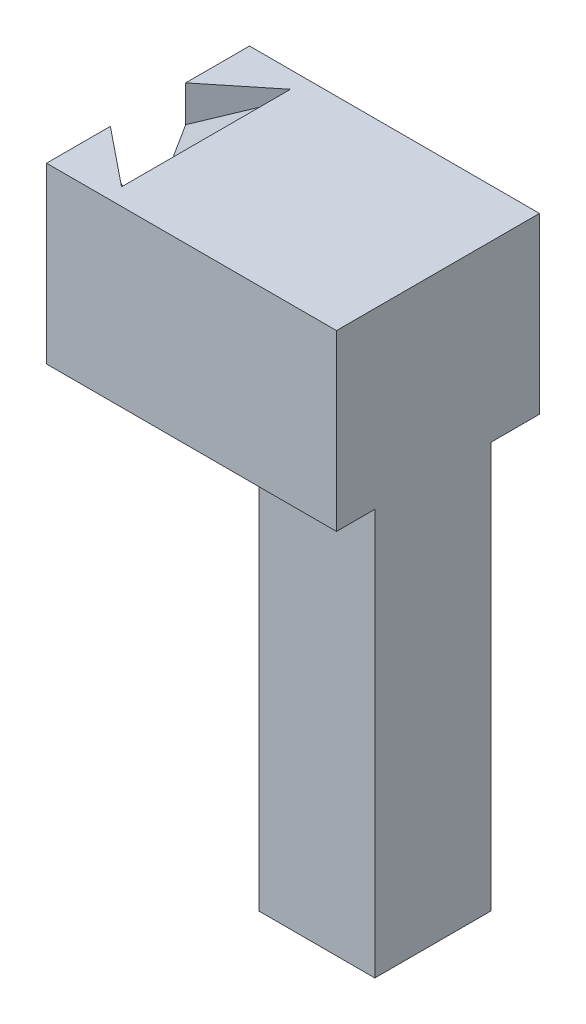
ISO-10303-21;
HEADER;
FILE_DESCRIPTION(('STEP AP214'),'2;1');
FILE_NAME('part.step','',(''),(''),'','','');
FILE_SCHEMA(('AUTOMOTIVE_DESIGN { 1 0 10303 214 1 1 1 1 }'));
ENDSEC;
DATA;
#1=APPLICATION_CONTEXT('core data for automotive mechanical design processes');
#2=APPLICATION_PROTOCOL_DEFINITION('international standard','automotive_design',2000,#1);
#3=PRODUCT_CONTEXT('',#1,'mechanical');
#4=PRODUCT('Part','Part','',(#3));
#5=PRODUCT_RELATED_PRODUCT_CATEGORY('part','',(#4));
#6=PRODUCT_DEFINITION_FORMATION('','',#4);
#7=PRODUCT_DEFINITION_CONTEXT('part definition',#1,'design');
#8=PRODUCT_DEFINITION('design','',#6,#7);
#9=PRODUCT_DEFINITION_SHAPE('','',#8);
#10=(LENGTH_UNIT() NAMED_UNIT(*) SI_UNIT(.MILLI.,.METRE.));
#11=(NAMED_UNIT(*) PLANE_ANGLE_UNIT() SI_UNIT($,.RADIAN.));
#12=(NAMED_UNIT(*) SI_UNIT($,.STERADIAN.) SOLID_ANGLE_UNIT());
#13=UNCERTAINTY_MEASURE_WITH_UNIT(LENGTH_MEASURE(1.E-05),#10,'distance_accuracy_value','');
#14=(GEOMETRIC_REPRESENTATION_CONTEXT(3) GLOBAL_UNCERTAINTY_ASSIGNED_CONTEXT((#13)) GLOBAL_UNIT_ASSIGNED_CONTEXT((#10,
#11,#12)) REPRESENTATION_CONTEXT('',''));
#15=CARTESIAN_POINT('',(0.,0.,0.));
#16=DIRECTION('',(0.,0.,1.));
#17=DIRECTION('',(1.,0.,0.));
#18=AXIS2_PLACEMENT_3D('',#15,#16,#17);
#19=CARTESIAN_POINT('',(0.,200.,0.));
#20=DIRECTION('',(0.,-1.,0.));
#21=DIRECTION('',(0.,0.,-1.));
#22=AXIS2_PLACEMENT_3D('',#19,#20,#21);
#23=PLANE('',#22);
#24=DIRECTION('',(0.,0.,-1.));
#25=VECTOR('',#24,1.);
#26=CARTESIAN_POINT('',(-80.,200.,-36.7720056850076));
#27=LINE('',#26,#25);
#28=CARTESIAN_POINT('',(-80.,200.,-14.7623867417742));
#29=VERTEX_POINT('',#28);
#30=CARTESIAN_POINT('',(-80.,200.,-36.7720056850076));
#31=VERTEX_POINT('',#30);
#32=EDGE_CURVE('E159',#29,#31,#27,.T.);
#33=ORIENTED_EDGE('',*,*,#32,.F.);
#34=DIRECTION('',(-0.777950212207444,0.,0.628325924442397));
#35=VECTOR('',#34,1.);
#36=CARTESIAN_POINT('',(-80.,200.,-14.7623867417742));
#37=LINE('',#36,#35);
#38=CARTESIAN_POINT('',(-60.,200.,-30.9157578594326));
#39=VERTEX_POINT('',#38);
#40=EDGE_CURVE('E142',#39,#29,#37,.T.);
#41=ORIENTED_EDGE('',*,*,#40,.F.);
#42=DIRECTION('',(0.,0.,-1.));
#43=VECTOR('',#42,1.);
#44=CARTESIAN_POINT('',(-60.,200.,-30.9157578594326));
#45=LINE('',#44,#43);
#46=CARTESIAN_POINT('',(-60.,200.,27.3717464894172));
#47=VERTEX_POINT('',#46);
#48=EDGE_CURVE('E152',#47,#39,#45,.T.);
#49=ORIENTED_EDGE('',*,*,#48,.F.);
#50=DIRECTION('',(0.777950212207444,0.,0.628325924442397));
#51=VECTOR('',#50,1.);
#52=CARTESIAN_POINT('',(-60.,200.,27.3717464894172));
#53=LINE('',#52,#51);
#54=CARTESIAN_POINT('',(-80.,200.,11.2183753717588));
#55=VERTEX_POINT('',#54);
#56=EDGE_CURVE('E133',#55,#47,#53,.T.);
#57=ORIENTED_EDGE('',*,*,#56,.F.);
#58=CARTESIAN_POINT('',(-80.,200.,33.2279943149924));
#59=VERTEX_POINT('',#58);
#60=EDGE_CURVE('E148',#59,#55,#27,.T.);
#61=ORIENTED_EDGE('',*,*,#60,.F.);
#62=DIRECTION('',(-1.,0.,0.));
#63=VECTOR('',#62,1.);
#64=CARTESIAN_POINT('',(112.195444572929,200.,33.2279943149924));
#65=LINE('',#64,#63);
#66=CARTESIAN_POINT('',(20.,200.,33.2279943149924));
#67=VERTEX_POINT('',#66);
#68=EDGE_CURVE('E168',#67,#59,#65,.T.);
#69=ORIENTED_EDGE('',*,*,#68,.F.);
#70=DIRECTION('',(0.,0.,-1.));
#71=VECTOR('',#70,1.);
#72=CARTESIAN_POINT('',(20.,200.,20.));
#73=LINE('',#72,#71);
#74=CARTESIAN_POINT('',(20.,200.,-36.7720056850076));
#75=VERTEX_POINT('',#74);
#76=EDGE_CURVE('E190',#67,#75,#73,.T.);
#77=ORIENTED_EDGE('',*,*,#76,.T.);
#78=DIRECTION('',(-1.,0.,0.));
#79=VECTOR('',#78,1.);
#80=CARTESIAN_POINT('',(112.195444572929,200.,-36.7720056850076));
#81=LINE('',#80,#79);
#82=EDGE_CURVE('E181',#75,#31,#81,.T.);
#83=ORIENTED_EDGE('',*,*,#82,.T.);
#84=EDGE_LOOP('',(#33,#41,#49,#57,#61,#69,#77,#83));
#85=FACE_BOUND('',#84,.T.);
#86=ADVANCED_FACE('F35',(#85),#23,.F.);
#87=CARTESIAN_POINT('',(0.,0.,0.));
#88=DIRECTION('',(0.,-1.,0.));
#89=DIRECTION('',(0.,0.,-1.));
#90=AXIS2_PLACEMENT_3D('',#87,#88,#89);
#91=PLANE('',#90);
#92=DIRECTION('',(0.,0.,-1.));
#93=VECTOR('',#92,1.);
#94=CARTESIAN_POINT('',(20.,0.,20.));
#95=LINE('',#94,#93);
#96=CARTESIAN_POINT('',(20.,0.,20.));
#97=VERTEX_POINT('',#96);
#98=CARTESIAN_POINT('',(20.,0.,-20.));
#99=VERTEX_POINT('',#98);
#100=EDGE_CURVE('E193',#97,#99,#95,.T.);
#101=ORIENTED_EDGE('',*,*,#100,.F.);
#102=DIRECTION('',(1.,0.,0.));
#103=VECTOR('',#102,1.);
#104=CARTESIAN_POINT('',(-20.,0.,20.));
#105=LINE('',#104,#103);
#106=CARTESIAN_POINT('',(-20.,0.,20.));
#107=VERTEX_POINT('',#106);
#108=EDGE_CURVE('E42',#107,#97,#105,.T.);
#109=ORIENTED_EDGE('',*,*,#108,.F.);
#110=DIRECTION('',(0.,0.,1.));
#111=VECTOR('',#110,1.);
#112=CARTESIAN_POINT('',(-20.,0.,20.));
#113=LINE('',#112,#111);
#114=CARTESIAN_POINT('',(-20.,0.,-20.));
#115=VERTEX_POINT('',#114);
#116=EDGE_CURVE('E204',#115,#107,#113,.T.);
#117=ORIENTED_EDGE('',*,*,#116,.F.);
#118=DIRECTION('',(-1.,0.,0.));
#119=VECTOR('',#118,1.);
#120=CARTESIAN_POINT('',(-20.,0.,-20.));
#121=LINE('',#120,#119);
#122=EDGE_CURVE('E198',#99,#115,#121,.T.);
#123=ORIENTED_EDGE('',*,*,#122,.F.);
#124=EDGE_LOOP('',(#101,#109,#117,#123));
#125=FACE_BOUND('',#124,.T.);
#126=ADVANCED_FACE('F218',(#125),#91,.T.);
#127=CARTESIAN_POINT('',(20.,200.,20.));
#128=DIRECTION('',(-1.,0.,0.));
#129=DIRECTION('',(0.,0.,1.));
#130=AXIS2_PLACEMENT_3D('',#127,#128,#129);
#131=PLANE('',#130);
#132=DIRECTION('',(0.,-1.,0.));
#133=VECTOR('',#132,1.);
#134=CARTESIAN_POINT('',(20.,200.,-20.));
#135=LINE('',#134,#133);
#136=CARTESIAN_POINT('',(20.,140.,-20.));
#137=VERTEX_POINT('',#136);
#138=EDGE_CURVE('E196',#137,#99,#135,.T.);
#139=ORIENTED_EDGE('',*,*,#138,.F.);
#140=DIRECTION('',(0.,0.,-1.));
#141=VECTOR('',#140,1.);
#142=CARTESIAN_POINT('',(20.,140.,-36.7720056850076));
#143=LINE('',#142,#141);
#144=CARTESIAN_POINT('',(20.,140.,-36.7720056850076));
#145=VERTEX_POINT('',#144);
#146=EDGE_CURVE('E172',#137,#145,#143,.T.);
#147=ORIENTED_EDGE('',*,*,#146,.T.);
#148=DIRECTION('',(0.,1.,0.));
#149=VECTOR('',#148,1.);
#150=CARTESIAN_POINT('',(20.,140.,-36.7720056850076));
#151=LINE('',#150,#149);
#152=EDGE_CURVE('E169',#145,#75,#151,.T.);
#153=ORIENTED_EDGE('',*,*,#152,.T.);
#154=ORIENTED_EDGE('',*,*,#76,.F.);
#155=DIRECTION('',(0.,-1.,0.));
#156=VECTOR('',#155,1.);
#157=CARTESIAN_POINT('',(20.,140.,33.2279943149924));
#158=LINE('',#157,#156);
#159=CARTESIAN_POINT('',(20.,140.,33.2279943149924));
#160=VERTEX_POINT('',#159);
#161=EDGE_CURVE('E175',#67,#160,#158,.T.);
#162=ORIENTED_EDGE('',*,*,#161,.T.);
#163=CARTESIAN_POINT('',(20.,140.,20.));
#164=VERTEX_POINT('',#163);
#165=EDGE_CURVE('E57',#160,#164,#143,.T.);
#166=ORIENTED_EDGE('',*,*,#165,.T.);
#167=DIRECTION('',(0.,-1.,0.));
#168=VECTOR('',#167,1.);
#169=CARTESIAN_POINT('',(20.,200.,20.));
#170=LINE('',#169,#168);
#171=EDGE_CURVE('E192',#164,#97,#170,.T.);
#172=ORIENTED_EDGE('',*,*,#171,.T.);
#173=ORIENTED_EDGE('',*,*,#100,.T.);
#174=EDGE_LOOP('',(#139,#147,#153,#154,#162,#166,#172,#173));
#175=FACE_BOUND('',#174,.T.);
#176=ADVANCED_FACE('F220',(#175),#131,.F.);
#177=CARTESIAN_POINT('',(-20.,200.,-20.));
#178=DIRECTION('',(0.,0.,1.));
#179=DIRECTION('',(1.,0.,0.));
#180=AXIS2_PLACEMENT_3D('',#177,#178,#179);
#181=PLANE('',#180);
#182=DIRECTION('',(0.,-1.,0.));
#183=VECTOR('',#182,1.);
#184=CARTESIAN_POINT('',(-20.,200.,-20.));
#185=LINE('',#184,#183);
#186=CARTESIAN_POINT('',(-20.,140.,-20.));
#187=VERTEX_POINT('',#186);
#188=EDGE_CURVE('E202',#187,#115,#185,.T.);
#189=ORIENTED_EDGE('',*,*,#188,.F.);
#190=DIRECTION('',(1.,0.,0.));
#191=VECTOR('',#190,1.);
#192=CARTESIAN_POINT('',(-20.,140.,-20.));
#193=LINE('',#192,#191);
#194=EDGE_CURVE('E187',#187,#137,#193,.T.);
#195=ORIENTED_EDGE('',*,*,#194,.T.);
#196=ORIENTED_EDGE('',*,*,#138,.T.);
#197=ORIENTED_EDGE('',*,*,#122,.T.);
#198=EDGE_LOOP('',(#189,#195,#196,#197));
#199=FACE_BOUND('',#198,.T.);
#200=ADVANCED_FACE('F224',(#199),#181,.F.);
#201=CARTESIAN_POINT('',(-20.,200.,20.));
#202=DIRECTION('',(1.,0.,0.));
#203=DIRECTION('',(0.,0.,-1.));
#204=AXIS2_PLACEMENT_3D('',#201,#202,#203);
#205=PLANE('',#204);
#206=DIRECTION('',(0.,-1.,0.));
#207=VECTOR('',#206,1.);
#208=CARTESIAN_POINT('',(-20.,200.,20.));
#209=LINE('',#208,#207);
#210=CARTESIAN_POINT('',(-20.,140.,20.));
#211=VERTEX_POINT('',#210);
#212=EDGE_CURVE('E207',#211,#107,#209,.T.);
#213=ORIENTED_EDGE('',*,*,#212,.F.);
#214=DIRECTION('',(0.,0.,-1.));
#215=VECTOR('',#214,1.);
#216=CARTESIAN_POINT('',(-20.,140.,20.));
#217=LINE('',#216,#215);
#218=EDGE_CURVE('E177',#211,#187,#217,.T.);
#219=ORIENTED_EDGE('',*,*,#218,.T.);
#220=ORIENTED_EDGE('',*,*,#188,.T.);
#221=ORIENTED_EDGE('',*,*,#116,.T.);
#222=EDGE_LOOP('',(#213,#219,#220,#221));
#223=FACE_BOUND('',#222,.T.);
#224=ADVANCED_FACE('F229',(#223),#205,.F.);
#225=CARTESIAN_POINT('',(-20.,200.,20.));
#226=DIRECTION('',(0.,0.,-1.));
#227=DIRECTION('',(-1.,0.,0.));
#228=AXIS2_PLACEMENT_3D('',#225,#226,#227);
#229=PLANE('',#228);
#230=ORIENTED_EDGE('',*,*,#171,.F.);
#231=DIRECTION('',(-1.,0.,0.));
#232=VECTOR('',#231,1.);
#233=CARTESIAN_POINT('',(-20.,140.,20.));
#234=LINE('',#233,#232);
#235=EDGE_CURVE('E11',#164,#211,#234,.T.);
#236=ORIENTED_EDGE('',*,*,#235,.T.);
#237=ORIENTED_EDGE('',*,*,#212,.T.);
#238=ORIENTED_EDGE('',*,*,#108,.T.);
#239=EDGE_LOOP('',(#230,#236,#237,#238));
#240=FACE_BOUND('',#239,.T.);
#241=ADVANCED_FACE('F213',(#240),#229,.F.);
#242=CARTESIAN_POINT('',(112.195444572929,140.,-36.7720056850076));
#243=DIRECTION('',(0.,-1.,0.));
#244=DIRECTION('',(0.,0.,-1.));
#245=AXIS2_PLACEMENT_3D('',#242,#243,#244);
#246=PLANE('',#245);
#247=ORIENTED_EDGE('',*,*,#194,.F.);
#248=ORIENTED_EDGE('',*,*,#218,.F.);
#249=ORIENTED_EDGE('',*,*,#235,.F.);
#250=ORIENTED_EDGE('',*,*,#165,.F.);
#251=DIRECTION('',(-1.,0.,0.));
#252=VECTOR('',#251,1.);
#253=CARTESIAN_POINT('',(112.195444572929,140.,33.2279943149924));
#254=LINE('',#253,#252);
#255=CARTESIAN_POINT('',(-80.,140.,33.2279943149924));
#256=VERTEX_POINT('',#255);
#257=EDGE_CURVE('E173',#160,#256,#254,.T.);
#258=ORIENTED_EDGE('',*,*,#257,.T.);
#259=DIRECTION('',(0.,0.,1.));
#260=VECTOR('',#259,1.);
#261=CARTESIAN_POINT('',(-80.,140.,-36.7720056850076));
#262=LINE('',#261,#260);
#263=CARTESIAN_POINT('',(-80.,140.,-36.7720056850076));
#264=VERTEX_POINT('',#263);
#265=EDGE_CURVE('E162',#264,#256,#262,.T.);
#266=ORIENTED_EDGE('',*,*,#265,.F.);
#267=DIRECTION('',(-1.,0.,0.));
#268=VECTOR('',#267,1.);
#269=CARTESIAN_POINT('',(112.195444572929,140.,-36.7720056850076));
#270=LINE('',#269,#268);
#271=EDGE_CURVE('E179',#145,#264,#270,.T.);
#272=ORIENTED_EDGE('',*,*,#271,.F.);
#273=ORIENTED_EDGE('',*,*,#146,.F.);
#274=EDGE_LOOP('',(#247,#248,#249,#250,#258,#266,#272,#273));
#275=FACE_BOUND('',#274,.T.);
#276=ADVANCED_FACE('F226',(#275),#246,.T.);
#277=CARTESIAN_POINT('',(112.195444572929,140.,33.2279943149924));
#278=DIRECTION('',(0.,0.,1.));
#279=DIRECTION('',(1.,0.,0.));
#280=AXIS2_PLACEMENT_3D('',#277,#278,#279);
#281=PLANE('',#280);
#282=ORIENTED_EDGE('',*,*,#161,.F.);
#283=ORIENTED_EDGE('',*,*,#68,.T.);
#284=DIRECTION('',(0.,1.,0.));
#285=VECTOR('',#284,1.);
#286=CARTESIAN_POINT('',(-80.,140.,33.2279943149924));
#287=LINE('',#286,#285);
#288=EDGE_CURVE('E157',#256,#59,#287,.T.);
#289=ORIENTED_EDGE('',*,*,#288,.F.);
#290=ORIENTED_EDGE('',*,*,#257,.F.);
#291=EDGE_LOOP('',(#282,#283,#289,#290));
#292=FACE_BOUND('',#291,.T.);
#293=ADVANCED_FACE('F247',(#292),#281,.T.);
#294=CARTESIAN_POINT('',(112.195444572929,140.,-36.7720056850076));
#295=DIRECTION('',(0.,0.,-1.));
#296=DIRECTION('',(-1.,0.,0.));
#297=AXIS2_PLACEMENT_3D('',#294,#295,#296);
#298=PLANE('',#297);
#299=ORIENTED_EDGE('',*,*,#152,.F.);
#300=ORIENTED_EDGE('',*,*,#271,.T.);
#301=DIRECTION('',(0.,-1.,0.));
#302=VECTOR('',#301,1.);
#303=CARTESIAN_POINT('',(-80.,140.,-36.7720056850076));
#304=LINE('',#303,#302);
#305=EDGE_CURVE('E158',#31,#264,#304,.T.);
#306=ORIENTED_EDGE('',*,*,#305,.F.);
#307=ORIENTED_EDGE('',*,*,#82,.F.);
#308=EDGE_LOOP('',(#299,#300,#306,#307));
#309=FACE_BOUND('',#308,.T.);
#310=ADVANCED_FACE('F252',(#309),#298,.T.);
#311=CARTESIAN_POINT('',(-80.,0.,0.));
#312=DIRECTION('',(1.,0.,0.));
#313=DIRECTION('',(0.,0.,-1.));
#314=AXIS2_PLACEMENT_3D('',#311,#312,#313);
#315=PLANE('',#314);
#316=DIRECTION('',(0.,-0.866025403784438,0.5));
#317=VECTOR('',#316,1.);
#318=CARTESIAN_POINT('',(-80.,187.5,-14.7623867417742));
#319=LINE('',#318,#317);
#320=CARTESIAN_POINT('',(-80.,187.5,-14.7623867417742));
#321=VERTEX_POINT('',#320);
#322=CARTESIAN_POINT('',(-80.,165.,-1.77200568500767));
#323=VERTEX_POINT('',#322);
#324=EDGE_CURVE('E49',#321,#323,#319,.T.);
#325=ORIENTED_EDGE('',*,*,#324,.F.);
#326=DIRECTION('',(0.,1.,0.));
#327=VECTOR('',#326,1.);
#328=CARTESIAN_POINT('',(-80.,127.35451474355,-14.7623867417742));
#329=LINE('',#328,#327);
#330=EDGE_CURVE('E289',#321,#29,#329,.T.);
#331=ORIENTED_EDGE('',*,*,#330,.T.);
#332=ORIENTED_EDGE('',*,*,#32,.T.);
#333=ORIENTED_EDGE('',*,*,#305,.T.);
#334=ORIENTED_EDGE('',*,*,#265,.T.);
#335=ORIENTED_EDGE('',*,*,#288,.T.);
#336=ORIENTED_EDGE('',*,*,#60,.T.);
#337=DIRECTION('',(0.,1.,0.));
#338=VECTOR('',#337,1.);
#339=CARTESIAN_POINT('',(-80.,127.35451474355,11.2183753717588));
#340=LINE('',#339,#338);
#341=CARTESIAN_POINT('',(-80.,187.5,11.2183753717588));
#342=VERTEX_POINT('',#341);
#343=EDGE_CURVE('E130',#342,#55,#340,.T.);
#344=ORIENTED_EDGE('',*,*,#343,.F.);
#345=DIRECTION('',(0.,0.866025403784439,0.5));
#346=VECTOR('',#345,1.);
#347=CARTESIAN_POINT('',(-80.,165.,-1.77200568500767));
#348=LINE('',#347,#346);
#349=EDGE_CURVE('E277',#323,#342,#348,.T.);
#350=ORIENTED_EDGE('',*,*,#349,.F.);
#351=EDGE_LOOP('',(#325,#331,#332,#333,#334,#335,#336,#344,#350));
#352=FACE_BOUND('',#351,.T.);
#353=ADVANCED_FACE('F154',(#352),#315,.F.);
#354=CARTESIAN_POINT('',(-80.,187.5,-14.7623867417742));
#355=DIRECTION('',(-0.4226182617407,-0.453153893518325,-0.784885567221395));
#356=DIRECTION('',(0.,0.866025403784438,-0.5));
#357=AXIS2_PLACEMENT_3D('',#354,#355,#356);
#358=PLANE('',#357);
#359=ORIENTED_EDGE('',*,*,#324,.T.);
#360=DIRECTION('',(-0.731317139824403,0.68203756568026,0.));
#361=VECTOR('',#360,1.);
#362=CARTESIAN_POINT('',(-91.2226796401869,175.466442922479,-1.77200568500767));
#363=LINE('',#362,#361);
#364=CARTESIAN_POINT('',(-60.,146.3476936738,-1.77200568500766));
#365=VERTEX_POINT('',#364);
#366=EDGE_CURVE('E273',#365,#323,#363,.T.);
#367=ORIENTED_EDGE('',*,*,#366,.F.);
#368=DIRECTION('',(0.,-0.866025403784438,0.5));
#369=VECTOR('',#368,1.);
#370=CARTESIAN_POINT('',(-60.,35.8196224490165,62.0414059896313));
#371=LINE('',#370,#369);
#372=CARTESIAN_POINT('',(-60.,196.8261531631,-30.9157578594326));
#373=VERTEX_POINT('',#372);
#374=EDGE_CURVE('E281',#373,#365,#371,.T.);
#375=ORIENTED_EDGE('',*,*,#374,.F.);
#376=DIRECTION('',(-0.731317139824403,-0.34101878284013,0.590661858214403));
#377=VECTOR('',#376,1.);
#378=CARTESIAN_POINT('',(-91.2226796401869,182.266778538761,-5.69818128364781));
#379=LINE('',#378,#377);
#380=EDGE_CURVE('E269',#373,#321,#379,.T.);
#381=ORIENTED_EDGE('',*,*,#380,.T.);
#382=EDGE_LOOP('',(#359,#367,#375,#381));
#383=FACE_BOUND('',#382,.T.);
#384=ADVANCED_FACE('F263',(#383),#358,.F.);
#385=CARTESIAN_POINT('',(-80.,165.,-1.77200568500767));
#386=DIRECTION('',(-0.4226182617407,-0.453153893518325,0.784885567221396));
#387=DIRECTION('',(0.,-0.866025403784439,-0.5));
#388=AXIS2_PLACEMENT_3D('',#385,#386,#387);
#389=PLANE('',#388);
#390=ORIENTED_EDGE('',*,*,#349,.T.);
#391=DIRECTION('',(-0.731317139824403,-0.34101878284013,-0.590661858214402));
#392=VECTOR('',#391,1.);
#393=CARTESIAN_POINT('',(-91.2226796401869,182.266778538761,2.15416991363247));
#394=LINE('',#393,#392);
#395=CARTESIAN_POINT('',(-60.,196.8261531631,27.3717464894172));
#396=VERTEX_POINT('',#395);
#397=EDGE_CURVE('E136',#396,#342,#394,.T.);
#398=ORIENTED_EDGE('',*,*,#397,.F.);
#399=DIRECTION('',(0.,0.866025403784439,0.5));
#400=VECTOR('',#399,1.);
#401=CARTESIAN_POINT('',(-60.,37.3542243878835,-64.6994145171427));
#402=LINE('',#401,#400);
#403=EDGE_CURVE('E279',#365,#396,#402,.T.);
#404=ORIENTED_EDGE('',*,*,#403,.F.);
#405=ORIENTED_EDGE('',*,*,#366,.T.);
#406=EDGE_LOOP('',(#390,#398,#404,#405));
#407=FACE_BOUND('',#406,.T.);
#408=ADVANCED_FACE('F288',(#407),#389,.F.);
#409=CARTESIAN_POINT('',(-60.,0.,0.));
#410=DIRECTION('',(-1.,0.,0.));
#411=DIRECTION('',(0.,0.,1.));
#412=AXIS2_PLACEMENT_3D('',#409,#410,#411);
#413=PLANE('',#412);
#414=ORIENTED_EDGE('',*,*,#374,.T.);
#415=ORIENTED_EDGE('',*,*,#403,.T.);
#416=DIRECTION('',(0.,1.,0.));
#417=VECTOR('',#416,1.);
#418=CARTESIAN_POINT('',(-60.,127.35451474355,27.3717464894172));
#419=LINE('',#418,#417);
#420=EDGE_CURVE('E141',#396,#47,#419,.T.);
#421=ORIENTED_EDGE('',*,*,#420,.T.);
#422=ORIENTED_EDGE('',*,*,#48,.T.);
#423=DIRECTION('',(0.,1.,0.));
#424=VECTOR('',#423,1.);
#425=CARTESIAN_POINT('',(-60.,127.35451474355,-30.9157578594326));
#426=LINE('',#425,#424);
#427=EDGE_CURVE('E291',#373,#39,#426,.T.);
#428=ORIENTED_EDGE('',*,*,#427,.F.);
#429=EDGE_LOOP('',(#414,#415,#421,#422,#428));
#430=FACE_BOUND('',#429,.T.);
#431=ADVANCED_FACE('F286',(#430),#413,.T.);
#432=CARTESIAN_POINT('',(-80.,127.35451474355,-14.7623867417742));
#433=DIRECTION('',(-0.628325924442397,0.,-0.777950212207444));
#434=DIRECTION('',(-0.777950212207444,0.,0.628325924442397));
#435=AXIS2_PLACEMENT_3D('',#432,#433,#434);
#436=PLANE('',#435);
#437=ORIENTED_EDGE('',*,*,#380,.F.);
#438=ORIENTED_EDGE('',*,*,#427,.T.);
#439=ORIENTED_EDGE('',*,*,#40,.T.);
#440=ORIENTED_EDGE('',*,*,#330,.F.);
#441=EDGE_LOOP('',(#437,#438,#439,#440));
#442=FACE_BOUND('',#441,.T.);
#443=ADVANCED_FACE('F298',(#442),#436,.F.);
#444=CARTESIAN_POINT('',(-60.,127.35451474355,27.3717464894172));
#445=DIRECTION('',(-0.628325924442397,0.,0.777950212207444));
#446=DIRECTION('',(0.777950212207444,0.,0.628325924442397));
#447=AXIS2_PLACEMENT_3D('',#444,#445,#446);
#448=PLANE('',#447);
#449=ORIENTED_EDGE('',*,*,#397,.T.);
#450=ORIENTED_EDGE('',*,*,#343,.T.);
#451=ORIENTED_EDGE('',*,*,#56,.T.);
#452=ORIENTED_EDGE('',*,*,#420,.F.);
#453=EDGE_LOOP('',(#449,#450,#451,#452));
#454=FACE_BOUND('',#453,.T.);
#455=ADVANCED_FACE('F132',(#454),#448,.F.);
#456=CLOSED_SHELL('',(#86,#126,#176,#200,#224,#241,#276,#293,#310,#353,#384,#408,#431,#443,#455));
#457=MANIFOLD_SOLID_BREP('B2',#456);
#458=ADVANCED_BREP_SHAPE_REPRESENTATION('',(#18,#457),#14);
#459=SHAPE_DEFINITION_REPRESENTATION(#9,#458);
ENDSEC;
END-ISO-10303-21;
